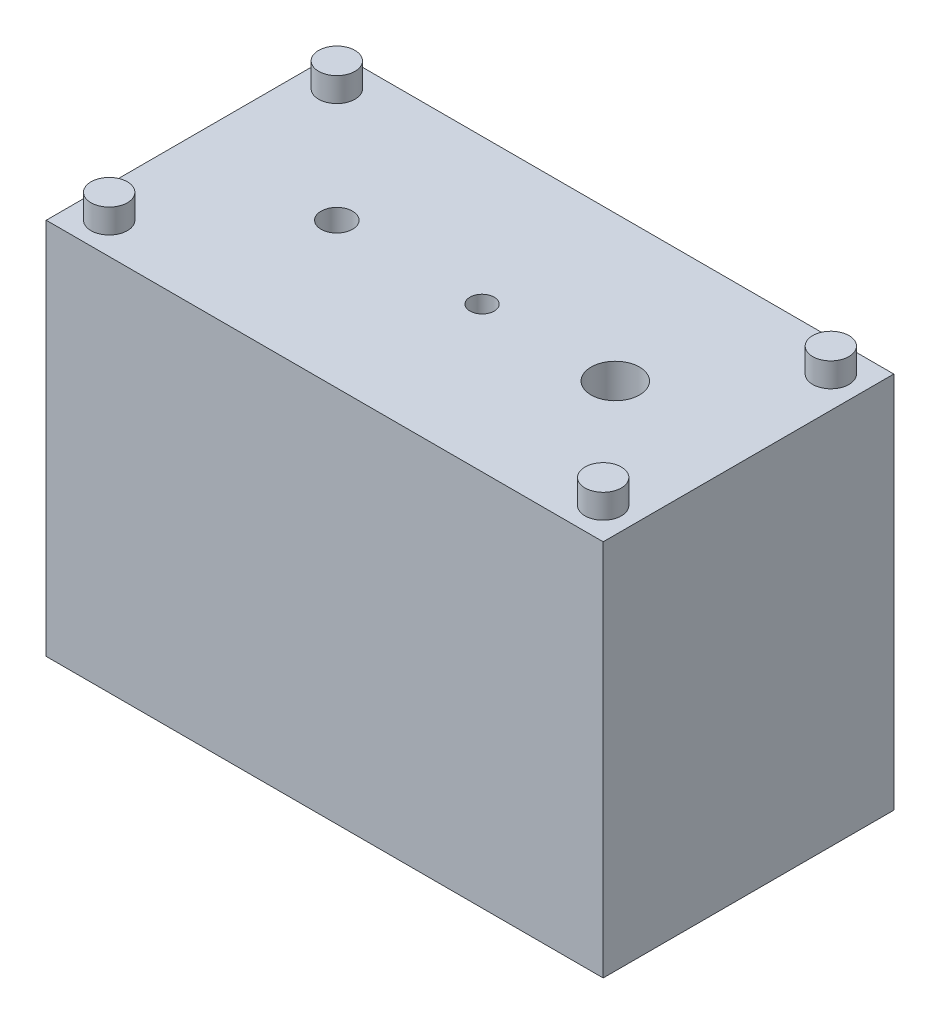
ISO-10303-21;
HEADER;
FILE_DESCRIPTION(('STEP AP214'),'2;1');
FILE_NAME('part.step','',(''),(''),'','','');
FILE_SCHEMA(('AUTOMOTIVE_DESIGN { 1 0 10303 214 1 1 1 1 }'));
ENDSEC;
DATA;
#1=APPLICATION_CONTEXT('core data for automotive mechanical design processes');
#2=APPLICATION_PROTOCOL_DEFINITION('international standard','automotive_design',2000,#1);
#3=PRODUCT_CONTEXT('',#1,'mechanical');
#4=PRODUCT('Part','Part','',(#3));
#5=PRODUCT_RELATED_PRODUCT_CATEGORY('part','',(#4));
#6=PRODUCT_DEFINITION_FORMATION('','',#4);
#7=PRODUCT_DEFINITION_CONTEXT('part definition',#1,'design');
#8=PRODUCT_DEFINITION('design','',#6,#7);
#9=PRODUCT_DEFINITION_SHAPE('','',#8);
#10=(LENGTH_UNIT() NAMED_UNIT(*) SI_UNIT(.MILLI.,.METRE.));
#11=(NAMED_UNIT(*) PLANE_ANGLE_UNIT() SI_UNIT($,.RADIAN.));
#12=(NAMED_UNIT(*) SI_UNIT($,.STERADIAN.) SOLID_ANGLE_UNIT());
#13=UNCERTAINTY_MEASURE_WITH_UNIT(LENGTH_MEASURE(1.E-05),#10,'distance_accuracy_value','');
#14=(GEOMETRIC_REPRESENTATION_CONTEXT(3) GLOBAL_UNCERTAINTY_ASSIGNED_CONTEXT((#13)) GLOBAL_UNIT_ASSIGNED_CONTEXT((#10,
#11,#12)) REPRESENTATION_CONTEXT('',''));
#15=CARTESIAN_POINT('',(0.,0.,0.));
#16=DIRECTION('',(0.,0.,1.));
#17=DIRECTION('',(1.,0.,0.));
#18=AXIS2_PLACEMENT_3D('',#15,#16,#17);
#19=CARTESIAN_POINT('',(11.5,15.6,-6.));
#20=DIRECTION('',(-1.,0.,0.));
#21=DIRECTION('',(0.,0.,1.));
#22=AXIS2_PLACEMENT_3D('',#19,#20,#21);
#23=PLANE('',#22);
#24=DIRECTION('',(0.,0.,-1.));
#25=VECTOR('',#24,1.);
#26=CARTESIAN_POINT('',(11.5,0.,-6.));
#27=LINE('',#26,#25);
#28=CARTESIAN_POINT('',(11.5,0.,6.));
#29=VERTEX_POINT('',#28);
#30=CARTESIAN_POINT('',(11.5,0.,-6.));
#31=VERTEX_POINT('',#30);
#32=EDGE_CURVE('E95',#29,#31,#27,.T.);
#33=ORIENTED_EDGE('',*,*,#32,.T.);
#34=DIRECTION('',(0.,-1.,0.));
#35=VECTOR('',#34,1.);
#36=CARTESIAN_POINT('',(11.5,15.6,-6.));
#37=LINE('',#36,#35);
#38=CARTESIAN_POINT('',(11.5,15.6,-6.));
#39=VERTEX_POINT('',#38);
#40=EDGE_CURVE('E11',#39,#31,#37,.T.);
#41=ORIENTED_EDGE('',*,*,#40,.F.);
#42=DIRECTION('',(0.,0.,-1.));
#43=VECTOR('',#42,1.);
#44=CARTESIAN_POINT('',(11.5,15.6,-6.));
#45=LINE('',#44,#43);
#46=CARTESIAN_POINT('',(11.5,15.6,6.));
#47=VERTEX_POINT('',#46);
#48=EDGE_CURVE('E83',#47,#39,#45,.T.);
#49=ORIENTED_EDGE('',*,*,#48,.F.);
#50=DIRECTION('',(0.,-1.,0.));
#51=VECTOR('',#50,1.);
#52=CARTESIAN_POINT('',(11.5,15.6,6.));
#53=LINE('',#52,#51);
#54=EDGE_CURVE('E91',#47,#29,#53,.T.);
#55=ORIENTED_EDGE('',*,*,#54,.T.);
#56=EDGE_LOOP('',(#33,#41,#49,#55));
#57=FACE_BOUND('',#56,.T.);
#58=ADVANCED_FACE('F32',(#57),#23,.F.);
#59=CARTESIAN_POINT('',(-11.5,15.6,-6.));
#60=DIRECTION('',(0.,0.,1.));
#61=DIRECTION('',(1.,0.,0.));
#62=AXIS2_PLACEMENT_3D('',#59,#60,#61);
#63=PLANE('',#62);
#64=DIRECTION('',(-1.,0.,0.));
#65=VECTOR('',#64,1.);
#66=CARTESIAN_POINT('',(-11.5,0.,-6.));
#67=LINE('',#66,#65);
#68=CARTESIAN_POINT('',(-11.5,0.,-6.));
#69=VERTEX_POINT('',#68);
#70=EDGE_CURVE('E87',#31,#69,#67,.T.);
#71=ORIENTED_EDGE('',*,*,#70,.T.);
#72=DIRECTION('',(0.,-1.,0.));
#73=VECTOR('',#72,1.);
#74=CARTESIAN_POINT('',(-11.5,15.6,-6.));
#75=LINE('',#74,#73);
#76=CARTESIAN_POINT('',(-11.5,15.6,-6.));
#77=VERTEX_POINT('',#76);
#78=EDGE_CURVE('E40',#77,#69,#75,.T.);
#79=ORIENTED_EDGE('',*,*,#78,.F.);
#80=DIRECTION('',(-1.,0.,0.));
#81=VECTOR('',#80,1.);
#82=CARTESIAN_POINT('',(-11.5,15.6,-6.));
#83=LINE('',#82,#81);
#84=EDGE_CURVE('E78',#39,#77,#83,.T.);
#85=ORIENTED_EDGE('',*,*,#84,.F.);
#86=ORIENTED_EDGE('',*,*,#40,.T.);
#87=EDGE_LOOP('',(#71,#79,#85,#86));
#88=FACE_BOUND('',#87,.T.);
#89=ADVANCED_FACE('F86',(#88),#63,.F.);
#90=CARTESIAN_POINT('',(-11.5,15.6,-6.));
#91=DIRECTION('',(1.,0.,0.));
#92=DIRECTION('',(0.,0.,-1.));
#93=AXIS2_PLACEMENT_3D('',#90,#91,#92);
#94=PLANE('',#93);
#95=DIRECTION('',(0.,0.,1.));
#96=VECTOR('',#95,1.);
#97=CARTESIAN_POINT('',(-11.5,0.,-6.));
#98=LINE('',#97,#96);
#99=CARTESIAN_POINT('',(-11.5,0.,6.));
#100=VERTEX_POINT('',#99);
#101=EDGE_CURVE('E65',#69,#100,#98,.T.);
#102=ORIENTED_EDGE('',*,*,#101,.T.);
#103=DIRECTION('',(0.,-1.,0.));
#104=VECTOR('',#103,1.);
#105=CARTESIAN_POINT('',(-11.5,15.6,6.));
#106=LINE('',#105,#104);
#107=CARTESIAN_POINT('',(-11.5,15.6,6.));
#108=VERTEX_POINT('',#107);
#109=EDGE_CURVE('E88',#108,#100,#106,.T.);
#110=ORIENTED_EDGE('',*,*,#109,.F.);
#111=DIRECTION('',(0.,0.,1.));
#112=VECTOR('',#111,1.);
#113=CARTESIAN_POINT('',(-11.5,15.6,-6.));
#114=LINE('',#113,#112);
#115=EDGE_CURVE('E81',#77,#108,#114,.T.);
#116=ORIENTED_EDGE('',*,*,#115,.F.);
#117=ORIENTED_EDGE('',*,*,#78,.T.);
#118=EDGE_LOOP('',(#102,#110,#116,#117));
#119=FACE_BOUND('',#118,.T.);
#120=ADVANCED_FACE('F89',(#119),#94,.F.);
#121=CARTESIAN_POINT('',(-11.5,15.6,6.));
#122=DIRECTION('',(0.,0.,-1.));
#123=DIRECTION('',(-1.,0.,0.));
#124=AXIS2_PLACEMENT_3D('',#121,#122,#123);
#125=PLANE('',#124);
#126=DIRECTION('',(1.,0.,0.));
#127=VECTOR('',#126,1.);
#128=CARTESIAN_POINT('',(-11.5,0.,6.));
#129=LINE('',#128,#127);
#130=EDGE_CURVE('E71',#100,#29,#129,.T.);
#131=ORIENTED_EDGE('',*,*,#130,.T.);
#132=ORIENTED_EDGE('',*,*,#54,.F.);
#133=DIRECTION('',(1.,0.,0.));
#134=VECTOR('',#133,1.);
#135=CARTESIAN_POINT('',(-11.5,15.6,6.));
#136=LINE('',#135,#134);
#137=EDGE_CURVE('E48',#108,#47,#136,.T.);
#138=ORIENTED_EDGE('',*,*,#137,.F.);
#139=ORIENTED_EDGE('',*,*,#109,.T.);
#140=EDGE_LOOP('',(#131,#132,#138,#139));
#141=FACE_BOUND('',#140,.T.);
#142=ADVANCED_FACE('F103',(#141),#125,.F.);
#143=CARTESIAN_POINT('',(0.,15.6,0.));
#144=DIRECTION('',(0.,1.,0.));
#145=DIRECTION('',(0.,0.,1.));
#146=AXIS2_PLACEMENT_3D('',#143,#144,#145);
#147=PLANE('',#146);
#148=CARTESIAN_POINT('',(6.,15.6,0.));
#149=DIRECTION('',(0.,1.,0.));
#150=DIRECTION('',(0.,0.,1.));
#151=AXIS2_PLACEMENT_3D('',#148,#149,#150);
#152=CIRCLE('',#151,1.);
#153=CARTESIAN_POINT('',(6.,15.6,1.));
#154=VERTEX_POINT('',#153);
#155=EDGE_CURVE('E145',#154,#154,#152,.T.);
#156=ORIENTED_EDGE('',*,*,#155,.F.);
#157=EDGE_LOOP('',(#156));
#158=FACE_BOUND('',#157,.T.);
#159=CARTESIAN_POINT('',(0.5,15.6,0.));
#160=DIRECTION('',(0.,1.,0.));
#161=DIRECTION('',(0.,0.,1.));
#162=AXIS2_PLACEMENT_3D('',#159,#160,#161);
#163=CIRCLE('',#162,0.5);
#164=CARTESIAN_POINT('',(0.5,15.6,0.500000000000001));
#165=VERTEX_POINT('',#164);
#166=EDGE_CURVE('E142',#165,#165,#163,.T.);
#167=ORIENTED_EDGE('',*,*,#166,.F.);
#168=EDGE_LOOP('',(#167));
#169=FACE_BOUND('',#168,.T.);
#170=CARTESIAN_POINT('',(-5.5,15.6,0.));
#171=DIRECTION('',(0.,1.,0.));
#172=DIRECTION('',(0.,0.,1.));
#173=AXIS2_PLACEMENT_3D('',#170,#171,#172);
#174=CIRCLE('',#173,0.65);
#175=CARTESIAN_POINT('',(-5.5,15.6,0.650000000000001));
#176=VERTEX_POINT('',#175);
#177=EDGE_CURVE('E136',#176,#176,#174,.T.);
#178=ORIENTED_EDGE('',*,*,#177,.F.);
#179=EDGE_LOOP('',(#178));
#180=FACE_BOUND('',#179,.T.);
#181=CARTESIAN_POINT('',(-10.2,15.6,4.7));
#182=DIRECTION('',(0.,1.,0.));
#183=DIRECTION('',(0.,0.,-1.));
#184=AXIS2_PLACEMENT_3D('',#181,#182,#183);
#185=CIRCLE('',#184,0.75);
#186=CARTESIAN_POINT('',(-10.2,15.6,3.95));
#187=VERTEX_POINT('',#186);
#188=EDGE_CURVE('E127',#187,#187,#185,.T.);
#189=ORIENTED_EDGE('',*,*,#188,.F.);
#190=EDGE_LOOP('',(#189));
#191=FACE_BOUND('',#190,.T.);
#192=CARTESIAN_POINT('',(10.2,15.6,4.7));
#193=DIRECTION('',(0.,1.,0.));
#194=DIRECTION('',(0.,0.,1.));
#195=AXIS2_PLACEMENT_3D('',#192,#193,#194);
#196=CIRCLE('',#195,0.75);
#197=CARTESIAN_POINT('',(10.2,15.6,5.45));
#198=VERTEX_POINT('',#197);
#199=EDGE_CURVE('E121',#198,#198,#196,.T.);
#200=ORIENTED_EDGE('',*,*,#199,.F.);
#201=EDGE_LOOP('',(#200));
#202=FACE_BOUND('',#201,.T.);
#203=CARTESIAN_POINT('',(-10.2,15.6,-4.7));
#204=DIRECTION('',(0.,1.,0.));
#205=DIRECTION('',(0.,0.,1.));
#206=AXIS2_PLACEMENT_3D('',#203,#204,#205);
#207=CIRCLE('',#206,0.75);
#208=CARTESIAN_POINT('',(-10.2,15.6,-3.95));
#209=VERTEX_POINT('',#208);
#210=EDGE_CURVE('E115',#209,#209,#207,.T.);
#211=ORIENTED_EDGE('',*,*,#210,.F.);
#212=EDGE_LOOP('',(#211));
#213=FACE_BOUND('',#212,.T.);
#214=CARTESIAN_POINT('',(10.2,15.6,-4.7));
#215=DIRECTION('',(0.,1.,0.));
#216=DIRECTION('',(0.,0.,-1.));
#217=AXIS2_PLACEMENT_3D('',#214,#215,#216);
#218=CIRCLE('',#217,0.75);
#219=CARTESIAN_POINT('',(10.2,15.6,-5.45));
#220=VERTEX_POINT('',#219);
#221=EDGE_CURVE('E109',#220,#220,#218,.T.);
#222=ORIENTED_EDGE('',*,*,#221,.F.);
#223=EDGE_LOOP('',(#222));
#224=FACE_BOUND('',#223,.T.);
#225=ORIENTED_EDGE('',*,*,#48,.T.);
#226=ORIENTED_EDGE('',*,*,#84,.T.);
#227=ORIENTED_EDGE('',*,*,#115,.T.);
#228=ORIENTED_EDGE('',*,*,#137,.T.);
#229=EDGE_LOOP('',(#225,#226,#227,#228));
#230=FACE_BOUND('',#229,.T.);
#231=ADVANCED_FACE('F79',(#158,#169,#180,#191,#202,#213,#224,#230),#147,.T.);
#232=CARTESIAN_POINT('',(0.,0.,0.));
#233=DIRECTION('',(0.,1.,0.));
#234=DIRECTION('',(0.,0.,1.));
#235=AXIS2_PLACEMENT_3D('',#232,#233,#234);
#236=PLANE('',#235);
#237=ORIENTED_EDGE('',*,*,#32,.F.);
#238=ORIENTED_EDGE('',*,*,#130,.F.);
#239=ORIENTED_EDGE('',*,*,#101,.F.);
#240=ORIENTED_EDGE('',*,*,#70,.F.);
#241=EDGE_LOOP('',(#237,#238,#239,#240));
#242=FACE_BOUND('',#241,.T.);
#243=ADVANCED_FACE('F106',(#242),#236,.F.);
#244=CARTESIAN_POINT('',(10.2,16.6,-4.7));
#245=DIRECTION('',(0.,-1.,0.));
#246=DIRECTION('',(0.,0.,-1.));
#247=AXIS2_PLACEMENT_3D('',#244,#245,#246);
#248=CYLINDRICAL_SURFACE('',#247,0.75);
#249=CARTESIAN_POINT('',(10.2,16.6,-4.7));
#250=DIRECTION('',(0.,1.,0.));
#251=DIRECTION('',(0.,0.,-1.));
#252=AXIS2_PLACEMENT_3D('',#249,#250,#251);
#253=CIRCLE('',#252,0.75);
#254=CARTESIAN_POINT('',(10.2,16.6,-5.45));
#255=VERTEX_POINT('',#254);
#256=EDGE_CURVE('E98',#255,#255,#253,.T.);
#257=ORIENTED_EDGE('',*,*,#256,.F.);
#258=EDGE_LOOP('',(#257));
#259=FACE_BOUND('',#258,.T.);
#260=ORIENTED_EDGE('',*,*,#221,.T.);
#261=EDGE_LOOP('',(#260));
#262=FACE_BOUND('',#261,.T.);
#263=ADVANCED_FACE('F175',(#259,#262),#248,.T.);
#264=CARTESIAN_POINT('',(10.2,16.6,-4.7));
#265=DIRECTION('',(0.,-1.,0.));
#266=DIRECTION('',(0.,0.,-1.));
#267=AXIS2_PLACEMENT_3D('',#264,#265,#266);
#268=PLANE('',#267);
#269=ORIENTED_EDGE('',*,*,#256,.T.);
#270=EDGE_LOOP('',(#269));
#271=FACE_BOUND('',#270,.T.);
#272=ADVANCED_FACE('F177',(#271),#268,.F.);
#273=CARTESIAN_POINT('',(-10.2,16.6,-4.7));
#274=DIRECTION('',(0.,-1.,0.));
#275=DIRECTION('',(0.,0.,-1.));
#276=AXIS2_PLACEMENT_3D('',#273,#274,#275);
#277=CYLINDRICAL_SURFACE('',#276,0.75);
#278=CARTESIAN_POINT('',(-10.2,16.6,-4.7));
#279=DIRECTION('',(0.,1.,0.));
#280=DIRECTION('',(0.,0.,1.));
#281=AXIS2_PLACEMENT_3D('',#278,#279,#280);
#282=CIRCLE('',#281,0.75);
#283=CARTESIAN_POINT('',(-10.2,16.6,-3.95));
#284=VERTEX_POINT('',#283);
#285=EDGE_CURVE('E112',#284,#284,#282,.T.);
#286=ORIENTED_EDGE('',*,*,#285,.F.);
#287=EDGE_LOOP('',(#286));
#288=FACE_BOUND('',#287,.T.);
#289=ORIENTED_EDGE('',*,*,#210,.T.);
#290=EDGE_LOOP('',(#289));
#291=FACE_BOUND('',#290,.T.);
#292=ADVANCED_FACE('F184',(#288,#291),#277,.T.);
#293=CARTESIAN_POINT('',(-10.2,16.6,-4.7));
#294=DIRECTION('',(0.,1.,0.));
#295=DIRECTION('',(0.,0.,1.));
#296=AXIS2_PLACEMENT_3D('',#293,#294,#295);
#297=PLANE('',#296);
#298=ORIENTED_EDGE('',*,*,#285,.T.);
#299=EDGE_LOOP('',(#298));
#300=FACE_BOUND('',#299,.T.);
#301=ADVANCED_FACE('F232',(#300),#297,.T.);
#302=CARTESIAN_POINT('',(10.2,16.6,4.7));
#303=DIRECTION('',(0.,-1.,0.));
#304=DIRECTION('',(0.,0.,-1.));
#305=AXIS2_PLACEMENT_3D('',#302,#303,#304);
#306=CYLINDRICAL_SURFACE('',#305,0.75);
#307=CARTESIAN_POINT('',(10.2,16.6,4.7));
#308=DIRECTION('',(0.,1.,0.));
#309=DIRECTION('',(0.,0.,1.));
#310=AXIS2_PLACEMENT_3D('',#307,#308,#309);
#311=CIRCLE('',#310,0.75);
#312=CARTESIAN_POINT('',(10.2,16.6,5.45));
#313=VERTEX_POINT('',#312);
#314=EDGE_CURVE('E118',#313,#313,#311,.T.);
#315=ORIENTED_EDGE('',*,*,#314,.F.);
#316=EDGE_LOOP('',(#315));
#317=FACE_BOUND('',#316,.T.);
#318=ORIENTED_EDGE('',*,*,#199,.T.);
#319=EDGE_LOOP('',(#318));
#320=FACE_BOUND('',#319,.T.);
#321=ADVANCED_FACE('F242',(#317,#320),#306,.T.);
#322=CARTESIAN_POINT('',(10.2,16.6,4.7));
#323=DIRECTION('',(0.,1.,0.));
#324=DIRECTION('',(0.,0.,1.));
#325=AXIS2_PLACEMENT_3D('',#322,#323,#324);
#326=PLANE('',#325);
#327=ORIENTED_EDGE('',*,*,#314,.T.);
#328=EDGE_LOOP('',(#327));
#329=FACE_BOUND('',#328,.T.);
#330=ADVANCED_FACE('F252',(#329),#326,.T.);
#331=CARTESIAN_POINT('',(-10.2,16.6,4.7));
#332=DIRECTION('',(0.,-1.,0.));
#333=DIRECTION('',(0.,0.,-1.));
#334=AXIS2_PLACEMENT_3D('',#331,#332,#333);
#335=CYLINDRICAL_SURFACE('',#334,0.75);
#336=CARTESIAN_POINT('',(-10.2,16.6,4.7));
#337=DIRECTION('',(0.,1.,0.));
#338=DIRECTION('',(0.,0.,-1.));
#339=AXIS2_PLACEMENT_3D('',#336,#337,#338);
#340=CIRCLE('',#339,0.75);
#341=CARTESIAN_POINT('',(-10.2,16.6,3.95));
#342=VERTEX_POINT('',#341);
#343=EDGE_CURVE('E124',#342,#342,#340,.T.);
#344=ORIENTED_EDGE('',*,*,#343,.F.);
#345=EDGE_LOOP('',(#344));
#346=FACE_BOUND('',#345,.T.);
#347=ORIENTED_EDGE('',*,*,#188,.T.);
#348=EDGE_LOOP('',(#347));
#349=FACE_BOUND('',#348,.T.);
#350=ADVANCED_FACE('F262',(#346,#349),#335,.T.);
#351=CARTESIAN_POINT('',(-10.2,16.6,4.7));
#352=DIRECTION('',(0.,-1.,0.));
#353=DIRECTION('',(0.,0.,-1.));
#354=AXIS2_PLACEMENT_3D('',#351,#352,#353);
#355=PLANE('',#354);
#356=ORIENTED_EDGE('',*,*,#343,.T.);
#357=EDGE_LOOP('',(#356));
#358=FACE_BOUND('',#357,.T.);
#359=ADVANCED_FACE('F271',(#358),#355,.F.);
#360=CARTESIAN_POINT('',(-5.5,11.6,0.));
#361=DIRECTION('',(0.,1.,0.));
#362=DIRECTION('',(0.,0.,1.));
#363=AXIS2_PLACEMENT_3D('',#360,#361,#362);
#364=CYLINDRICAL_SURFACE('',#363,0.65);
#365=CARTESIAN_POINT('',(-5.5,11.6,0.));
#366=DIRECTION('',(0.,1.,0.));
#367=DIRECTION('',(0.,0.,1.));
#368=AXIS2_PLACEMENT_3D('',#365,#366,#367);
#369=CIRCLE('',#368,0.65);
#370=CARTESIAN_POINT('',(-5.5,11.6,0.650000000000001));
#371=VERTEX_POINT('',#370);
#372=EDGE_CURVE('E133',#371,#371,#369,.T.);
#373=ORIENTED_EDGE('',*,*,#372,.F.);
#374=EDGE_LOOP('',(#373));
#375=FACE_BOUND('',#374,.T.);
#376=ORIENTED_EDGE('',*,*,#177,.T.);
#377=EDGE_LOOP('',(#376));
#378=FACE_BOUND('',#377,.T.);
#379=ADVANCED_FACE('F280',(#375,#378),#364,.F.);
#380=CARTESIAN_POINT('',(-5.5,11.6,0.));
#381=DIRECTION('',(0.,1.,0.));
#382=DIRECTION('',(0.,0.,1.));
#383=AXIS2_PLACEMENT_3D('',#380,#381,#382);
#384=PLANE('',#383);
#385=ORIENTED_EDGE('',*,*,#372,.T.);
#386=EDGE_LOOP('',(#385));
#387=FACE_BOUND('',#386,.T.);
#388=ADVANCED_FACE('F290',(#387),#384,.T.);
#389=CARTESIAN_POINT('',(0.5,11.6,0.));
#390=DIRECTION('',(0.,1.,0.));
#391=DIRECTION('',(0.,0.,1.));
#392=AXIS2_PLACEMENT_3D('',#389,#390,#391);
#393=CYLINDRICAL_SURFACE('',#392,0.5);
#394=CARTESIAN_POINT('',(0.5,11.6,0.));
#395=DIRECTION('',(0.,1.,0.));
#396=DIRECTION('',(0.,0.,1.));
#397=AXIS2_PLACEMENT_3D('',#394,#395,#396);
#398=CIRCLE('',#397,0.5);
#399=CARTESIAN_POINT('',(0.5,11.6,0.500000000000001));
#400=VERTEX_POINT('',#399);
#401=EDGE_CURVE('E139',#400,#400,#398,.T.);
#402=ORIENTED_EDGE('',*,*,#401,.F.);
#403=EDGE_LOOP('',(#402));
#404=FACE_BOUND('',#403,.T.);
#405=ORIENTED_EDGE('',*,*,#166,.T.);
#406=EDGE_LOOP('',(#405));
#407=FACE_BOUND('',#406,.T.);
#408=ADVANCED_FACE('F297',(#404,#407),#393,.F.);
#409=CARTESIAN_POINT('',(0.5,11.6,0.));
#410=DIRECTION('',(0.,1.,0.));
#411=DIRECTION('',(0.,0.,1.));
#412=AXIS2_PLACEMENT_3D('',#409,#410,#411);
#413=PLANE('',#412);
#414=ORIENTED_EDGE('',*,*,#401,.T.);
#415=EDGE_LOOP('',(#414));
#416=FACE_BOUND('',#415,.T.);
#417=ADVANCED_FACE('F156',(#416),#413,.T.);
#418=CARTESIAN_POINT('',(6.,11.6,0.));
#419=DIRECTION('',(0.,1.,0.));
#420=DIRECTION('',(0.,0.,1.));
#421=AXIS2_PLACEMENT_3D('',#418,#419,#420);
#422=CYLINDRICAL_SURFACE('',#421,1.);
#423=CARTESIAN_POINT('',(6.,11.6,0.));
#424=DIRECTION('',(0.,1.,0.));
#425=DIRECTION('',(0.,0.,1.));
#426=AXIS2_PLACEMENT_3D('',#423,#424,#425);
#427=CIRCLE('',#426,1.);
#428=CARTESIAN_POINT('',(6.,11.6,1.));
#429=VERTEX_POINT('',#428);
#430=EDGE_CURVE('E130',#429,#429,#427,.T.);
#431=ORIENTED_EDGE('',*,*,#430,.F.);
#432=EDGE_LOOP('',(#431));
#433=FACE_BOUND('',#432,.T.);
#434=ORIENTED_EDGE('',*,*,#155,.T.);
#435=EDGE_LOOP('',(#434));
#436=FACE_BOUND('',#435,.T.);
#437=ADVANCED_FACE('F153',(#433,#436),#422,.F.);
#438=CARTESIAN_POINT('',(6.,11.6,0.));
#439=DIRECTION('',(0.,1.,0.));
#440=DIRECTION('',(0.,0.,1.));
#441=AXIS2_PLACEMENT_3D('',#438,#439,#440);
#442=PLANE('',#441);
#443=ORIENTED_EDGE('',*,*,#430,.T.);
#444=EDGE_LOOP('',(#443));
#445=FACE_BOUND('',#444,.T.);
#446=ADVANCED_FACE('F151',(#445),#442,.T.);
#447=CLOSED_SHELL('',(#58,#89,#120,#142,#231,#243,#263,#272,#292,#301,#321,#330,#350,#359,#379,
#388,#408,#417,#437,#446));
#448=MANIFOLD_SOLID_BREP('B2',#447);
#449=ADVANCED_BREP_SHAPE_REPRESENTATION('',(#18,#448),#14);
#450=SHAPE_DEFINITION_REPRESENTATION(#9,#449);
ENDSEC;
END-ISO-10303-21;
